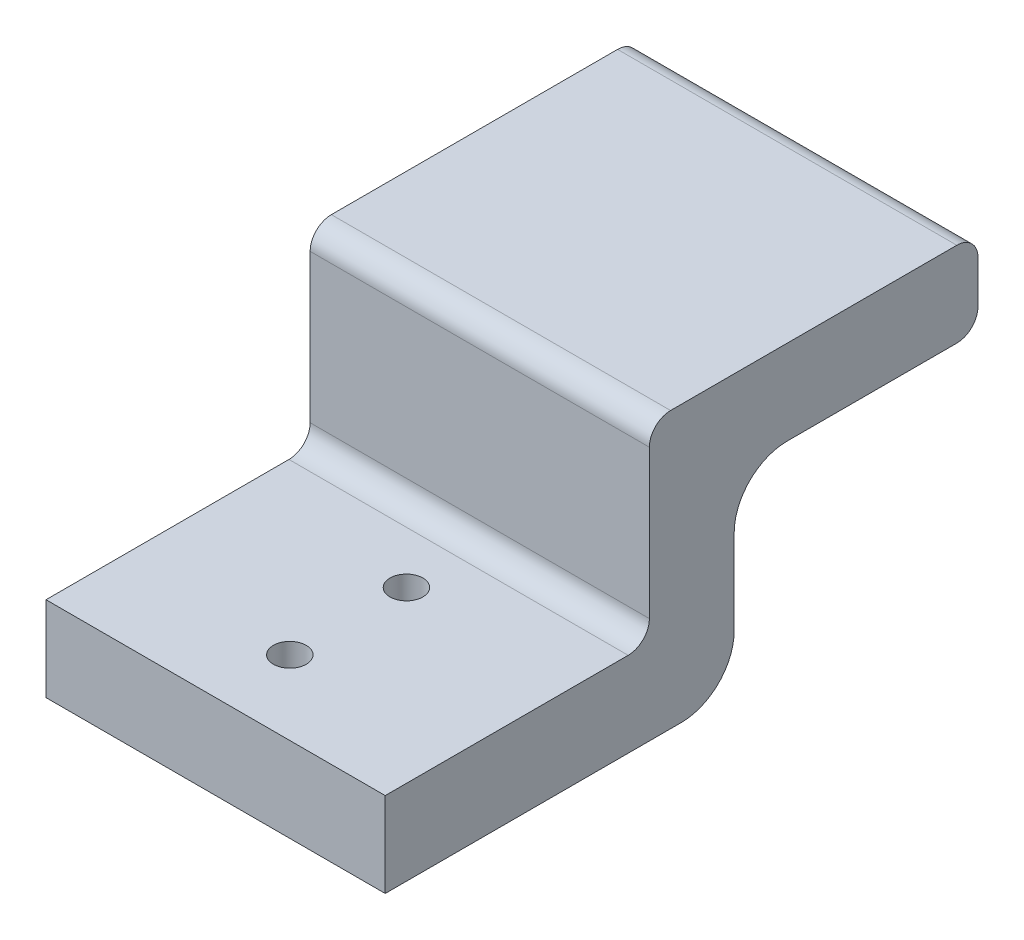
ISO-10303-21;
HEADER;
FILE_DESCRIPTION(('STEP AP214'),'2;1');
FILE_NAME('part.step','',(''),(''),'','','');
FILE_SCHEMA(('AUTOMOTIVE_DESIGN { 1 0 10303 214 1 1 1 1 }'));
ENDSEC;
DATA;
#1=APPLICATION_CONTEXT('core data for automotive mechanical design processes');
#2=APPLICATION_PROTOCOL_DEFINITION('international standard','automotive_design',2000,#1);
#3=PRODUCT_CONTEXT('',#1,'mechanical');
#4=PRODUCT('Part','Part','',(#3));
#5=PRODUCT_RELATED_PRODUCT_CATEGORY('part','',(#4));
#6=PRODUCT_DEFINITION_FORMATION('','',#4);
#7=PRODUCT_DEFINITION_CONTEXT('part definition',#1,'design');
#8=PRODUCT_DEFINITION('design','',#6,#7);
#9=PRODUCT_DEFINITION_SHAPE('','',#8);
#10=(LENGTH_UNIT() NAMED_UNIT(*) SI_UNIT(.MILLI.,.METRE.));
#11=(NAMED_UNIT(*) PLANE_ANGLE_UNIT() SI_UNIT($,.RADIAN.));
#12=(NAMED_UNIT(*) SI_UNIT($,.STERADIAN.) SOLID_ANGLE_UNIT());
#13=UNCERTAINTY_MEASURE_WITH_UNIT(LENGTH_MEASURE(1.E-05),#10,'distance_accuracy_value','');
#14=(GEOMETRIC_REPRESENTATION_CONTEXT(3) GLOBAL_UNCERTAINTY_ASSIGNED_CONTEXT((#13)) GLOBAL_UNIT_ASSIGNED_CONTEXT((#10,
#11,#12)) REPRESENTATION_CONTEXT('',''));
#15=CARTESIAN_POINT('',(0.,0.,0.));
#16=DIRECTION('',(0.,0.,1.));
#17=DIRECTION('',(1.,0.,0.));
#18=AXIS2_PLACEMENT_3D('',#15,#16,#17);
#19=CARTESIAN_POINT('',(-16.,8.,-10.4175714326032));
#20=DIRECTION('',(0.,0.,-1.));
#21=DIRECTION('',(-1.,0.,0.));
#22=AXIS2_PLACEMENT_3D('',#19,#20,#21);
#23=PLANE('',#22);
#24=DIRECTION('',(0.,-1.,0.));
#25=VECTOR('',#24,1.);
#26=CARTESIAN_POINT('',(16.,8.,-10.4175714326032));
#27=LINE('',#26,#25);
#28=CARTESIAN_POINT('',(16.,13.,-10.4175714326032));
#29=VERTEX_POINT('',#28);
#30=CARTESIAN_POINT('',(16.,5.,-10.4175714326032));
#31=VERTEX_POINT('',#30);
#32=EDGE_CURVE('E329',#29,#31,#27,.T.);
#33=ORIENTED_EDGE('',*,*,#32,.T.);
#34=DIRECTION('',(1.,0.,0.));
#35=VECTOR('',#34,1.);
#36=CARTESIAN_POINT('',(-16.,5.,-10.4175714326032));
#37=LINE('',#36,#35);
#38=CARTESIAN_POINT('',(-16.,5.,-10.4175714326032));
#39=VERTEX_POINT('',#38);
#40=EDGE_CURVE('E58',#31,#39,#37,.F.);
#41=ORIENTED_EDGE('',*,*,#40,.T.);
#42=DIRECTION('',(0.,-1.,0.));
#43=VECTOR('',#42,1.);
#44=CARTESIAN_POINT('',(-16.,8.,-10.4175714326032));
#45=LINE('',#44,#43);
#46=CARTESIAN_POINT('',(-16.,13.,-10.4175714326032));
#47=VERTEX_POINT('',#46);
#48=EDGE_CURVE('E336',#47,#39,#45,.T.);
#49=ORIENTED_EDGE('',*,*,#48,.F.);
#50=DIRECTION('',(1.,0.,0.));
#51=VECTOR('',#50,1.);
#52=CARTESIAN_POINT('',(16.,13.,-10.4175714326032));
#53=LINE('',#52,#51);
#54=EDGE_CURVE('E387',#47,#29,#53,.T.);
#55=ORIENTED_EDGE('',*,*,#54,.T.);
#56=EDGE_LOOP('',(#33,#41,#49,#55));
#57=FACE_BOUND('',#56,.T.);
#58=ADVANCED_FACE('F35',(#57),#23,.T.);
#59=CARTESIAN_POINT('',(0.,8.,0.));
#60=DIRECTION('',(0.,-1.,0.));
#61=DIRECTION('',(0.,0.,-1.));
#62=AXIS2_PLACEMENT_3D('',#59,#60,#61);
#63=PLANE('',#62);
#64=CARTESIAN_POINT('',(0.,8.,15.5));
#65=DIRECTION('',(0.,-1.,0.));
#66=DIRECTION('',(0.,0.,-1.));
#67=AXIS2_PLACEMENT_3D('',#64,#65,#66);
#68=CIRCLE('',#67,1.54999999999999);
#69=CARTESIAN_POINT('',(0.,8.,13.95));
#70=VERTEX_POINT('',#69);
#71=EDGE_CURVE('E241',#70,#70,#68,.T.);
#72=ORIENTED_EDGE('',*,*,#71,.T.);
#73=EDGE_LOOP('',(#72));
#74=FACE_BOUND('',#73,.T.);
#75=CARTESIAN_POINT('',(0.,8.,4.50000000000001));
#76=DIRECTION('',(0.,-1.,0.));
#77=DIRECTION('',(0.,0.,-1.));
#78=AXIS2_PLACEMENT_3D('',#75,#76,#77);
#79=CIRCLE('',#78,1.54999999999999);
#80=CARTESIAN_POINT('',(0.,8.,2.95000000000002));
#81=VERTEX_POINT('',#80);
#82=EDGE_CURVE('E450',#81,#81,#79,.T.);
#83=ORIENTED_EDGE('',*,*,#82,.T.);
#84=EDGE_LOOP('',(#83));
#85=FACE_BOUND('',#84,.T.);
#86=DIRECTION('',(0.,0.,1.));
#87=VECTOR('',#86,1.);
#88=CARTESIAN_POINT('',(16.,8.,-10.4175714326032));
#89=LINE('',#88,#87);
#90=CARTESIAN_POINT('',(16.,8.,-0.417571432603155));
#91=VERTEX_POINT('',#90);
#92=CARTESIAN_POINT('',(16.,8.,22.5));
#93=VERTEX_POINT('',#92);
#94=EDGE_CURVE('E320',#91,#93,#89,.T.);
#95=ORIENTED_EDGE('',*,*,#94,.F.);
#96=DIRECTION('',(1.,0.,0.));
#97=VECTOR('',#96,1.);
#98=CARTESIAN_POINT('',(0.,8.,-0.417571432603151));
#99=LINE('',#98,#97);
#100=CARTESIAN_POINT('',(-16.,8.,-0.417571432603146));
#101=VERTEX_POINT('',#100);
#102=EDGE_CURVE('E357',#91,#101,#99,.F.);
#103=ORIENTED_EDGE('',*,*,#102,.T.);
#104=DIRECTION('',(0.,0.,-1.));
#105=VECTOR('',#104,1.);
#106=CARTESIAN_POINT('',(-16.,8.,22.5));
#107=LINE('',#106,#105);
#108=CARTESIAN_POINT('',(-16.,8.,22.5));
#109=VERTEX_POINT('',#108);
#110=EDGE_CURVE('E326',#109,#101,#107,.T.);
#111=ORIENTED_EDGE('',*,*,#110,.F.);
#112=DIRECTION('',(-1.,0.,0.));
#113=VECTOR('',#112,1.);
#114=CARTESIAN_POINT('',(16.,8.,22.5));
#115=LINE('',#114,#113);
#116=EDGE_CURVE('E322',#93,#109,#115,.T.);
#117=ORIENTED_EDGE('',*,*,#116,.F.);
#118=EDGE_LOOP('',(#95,#103,#111,#117));
#119=FACE_BOUND('',#118,.T.);
#120=ADVANCED_FACE('F459',(#74,#85,#119),#63,.F.);
#121=CARTESIAN_POINT('',(-16.,8.,22.5));
#122=DIRECTION('',(-1.,0.,0.));
#123=DIRECTION('',(0.,0.,1.));
#124=AXIS2_PLACEMENT_3D('',#121,#122,#123);
#125=PLANE('',#124);
#126=ORIENTED_EDGE('',*,*,#48,.T.);
#127=CARTESIAN_POINT('',(-16.,5.,-5.41757143260315));
#128=DIRECTION('',(-1.,0.,0.));
#129=DIRECTION('',(0.,0.,1.));
#130=AXIS2_PLACEMENT_3D('',#127,#128,#129);
#131=CIRCLE('',#130,5.);
#132=CARTESIAN_POINT('',(-16.,0.,-5.41757143260315));
#133=VERTEX_POINT('',#132);
#134=EDGE_CURVE('E391',#39,#133,#131,.T.);
#135=ORIENTED_EDGE('',*,*,#134,.T.);
#136=DIRECTION('',(0.,0.,-1.));
#137=VECTOR('',#136,1.);
#138=CARTESIAN_POINT('',(-16.,0.,22.5));
#139=LINE('',#138,#137);
#140=CARTESIAN_POINT('',(-16.,0.,22.5));
#141=VERTEX_POINT('',#140);
#142=EDGE_CURVE('E323',#141,#133,#139,.T.);
#143=ORIENTED_EDGE('',*,*,#142,.F.);
#144=DIRECTION('',(0.,-1.,0.));
#145=VECTOR('',#144,1.);
#146=CARTESIAN_POINT('',(-16.,8.,22.5));
#147=LINE('',#146,#145);
#148=EDGE_CURVE('E339',#109,#141,#147,.T.);
#149=ORIENTED_EDGE('',*,*,#148,.F.);
#150=ORIENTED_EDGE('',*,*,#110,.T.);
#151=CARTESIAN_POINT('',(-16.,10.,-0.417571432603148));
#152=DIRECTION('',(-1.,0.,0.));
#153=DIRECTION('',(0.,0.,1.));
#154=AXIS2_PLACEMENT_3D('',#151,#152,#153);
#155=CIRCLE('',#154,2.);
#156=CARTESIAN_POINT('',(-16.,10.,-2.41757143260315));
#157=VERTEX_POINT('',#156);
#158=EDGE_CURVE('E361',#101,#157,#155,.F.);
#159=ORIENTED_EDGE('',*,*,#158,.T.);
#160=DIRECTION('',(0.,-1.,0.));
#161=VECTOR('',#160,1.);
#162=CARTESIAN_POINT('',(-16.,8.,-2.41757143260315));
#163=LINE('',#162,#161);
#164=CARTESIAN_POINT('',(-16.,24.,-2.41757143260315));
#165=VERTEX_POINT('',#164);
#166=EDGE_CURVE('E436',#165,#157,#163,.T.);
#167=ORIENTED_EDGE('',*,*,#166,.F.);
#168=CARTESIAN_POINT('',(-16.,24.,-4.41757143260315));
#169=DIRECTION('',(-1.,0.,0.));
#170=DIRECTION('',(0.,0.,1.));
#171=AXIS2_PLACEMENT_3D('',#168,#169,#170);
#172=CIRCLE('',#171,2.);
#173=CARTESIAN_POINT('',(-16.,26.,-4.41757143260315));
#174=VERTEX_POINT('',#173);
#175=EDGE_CURVE('E354',#165,#174,#172,.T.);
#176=ORIENTED_EDGE('',*,*,#175,.T.);
#177=DIRECTION('',(0.,0.,1.));
#178=VECTOR('',#177,1.);
#179=CARTESIAN_POINT('',(-16.,26.,-10.4175714326031));
#180=LINE('',#179,#178);
#181=CARTESIAN_POINT('',(-16.,26.,-31.4175714326031));
#182=VERTEX_POINT('',#181);
#183=EDGE_CURVE('E439',#182,#174,#180,.T.);
#184=ORIENTED_EDGE('',*,*,#183,.F.);
#185=CARTESIAN_POINT('',(-16.,24.,-31.4175714326031));
#186=DIRECTION('',(-1.,0.,0.));
#187=DIRECTION('',(0.,0.,1.));
#188=AXIS2_PLACEMENT_3D('',#185,#186,#187);
#189=CIRCLE('',#188,2.);
#190=CARTESIAN_POINT('',(-16.,24.,-33.4175714326031));
#191=VERTEX_POINT('',#190);
#192=EDGE_CURVE('E377',#182,#191,#189,.T.);
#193=ORIENTED_EDGE('',*,*,#192,.T.);
#194=DIRECTION('',(0.,1.,0.));
#195=VECTOR('',#194,1.);
#196=CARTESIAN_POINT('',(-16.,26.,-33.4175714326031));
#197=LINE('',#196,#195);
#198=CARTESIAN_POINT('',(-16.,20.,-33.4175714326031));
#199=VERTEX_POINT('',#198);
#200=EDGE_CURVE('E443',#199,#191,#197,.T.);
#201=ORIENTED_EDGE('',*,*,#200,.F.);
#202=CARTESIAN_POINT('',(-16.,20.,-31.4175714326031));
#203=DIRECTION('',(-1.,0.,0.));
#204=DIRECTION('',(0.,0.,1.));
#205=AXIS2_PLACEMENT_3D('',#202,#203,#204);
#206=CIRCLE('',#205,2.);
#207=CARTESIAN_POINT('',(-16.,18.,-31.4175714326031));
#208=VERTEX_POINT('',#207);
#209=EDGE_CURVE('E374',#199,#208,#206,.T.);
#210=ORIENTED_EDGE('',*,*,#209,.T.);
#211=DIRECTION('',(0.,0.,-1.));
#212=VECTOR('',#211,1.);
#213=CARTESIAN_POINT('',(-16.,18.,-10.4175714326031));
#214=LINE('',#213,#212);
#215=CARTESIAN_POINT('',(-16.,18.,-15.4175714326032));
#216=VERTEX_POINT('',#215);
#217=EDGE_CURVE('E409',#216,#208,#214,.T.);
#218=ORIENTED_EDGE('',*,*,#217,.F.);
#219=CARTESIAN_POINT('',(-16.,13.,-15.4175714326032));
#220=DIRECTION('',(-1.,0.,0.));
#221=DIRECTION('',(0.,0.,1.));
#222=AXIS2_PLACEMENT_3D('',#219,#220,#221);
#223=CIRCLE('',#222,5.);
#224=EDGE_CURVE('E11',#216,#47,#223,.F.);
#225=ORIENTED_EDGE('',*,*,#224,.T.);
#226=EDGE_LOOP('',(#126,#135,#143,#149,#150,#159,#167,#176,#184,#193,#201,#210,#218,#225));
#227=FACE_BOUND('',#226,.T.);
#228=ADVANCED_FACE('F407',(#227),#125,.T.);
#229=CARTESIAN_POINT('',(16.,8.,22.5));
#230=DIRECTION('',(0.,0.,1.));
#231=DIRECTION('',(1.,0.,0.));
#232=AXIS2_PLACEMENT_3D('',#229,#230,#231);
#233=PLANE('',#232);
#234=DIRECTION('',(-1.,0.,0.));
#235=VECTOR('',#234,1.);
#236=CARTESIAN_POINT('',(16.,0.,22.5));
#237=LINE('',#236,#235);
#238=CARTESIAN_POINT('',(16.,0.,22.5));
#239=VERTEX_POINT('',#238);
#240=EDGE_CURVE('E331',#239,#141,#237,.T.);
#241=ORIENTED_EDGE('',*,*,#240,.F.);
#242=DIRECTION('',(0.,-1.,0.));
#243=VECTOR('',#242,1.);
#244=CARTESIAN_POINT('',(16.,8.,22.5));
#245=LINE('',#244,#243);
#246=EDGE_CURVE('E341',#93,#239,#245,.T.);
#247=ORIENTED_EDGE('',*,*,#246,.F.);
#248=ORIENTED_EDGE('',*,*,#116,.T.);
#249=ORIENTED_EDGE('',*,*,#148,.T.);
#250=EDGE_LOOP('',(#241,#247,#248,#249));
#251=FACE_BOUND('',#250,.T.);
#252=ADVANCED_FACE('F419',(#251),#233,.T.);
#253=CARTESIAN_POINT('',(16.,8.,-10.4175714326032));
#254=DIRECTION('',(1.,0.,0.));
#255=DIRECTION('',(0.,0.,-1.));
#256=AXIS2_PLACEMENT_3D('',#253,#254,#255);
#257=PLANE('',#256);
#258=DIRECTION('',(0.,0.,1.));
#259=VECTOR('',#258,1.);
#260=CARTESIAN_POINT('',(16.,0.,-10.4175714326032));
#261=LINE('',#260,#259);
#262=CARTESIAN_POINT('',(16.,0.,-5.41757143260315));
#263=VERTEX_POINT('',#262);
#264=EDGE_CURVE('E309',#263,#239,#261,.T.);
#265=ORIENTED_EDGE('',*,*,#264,.F.);
#266=CARTESIAN_POINT('',(16.,5.,-5.41757143260315));
#267=DIRECTION('',(1.,0.,0.));
#268=DIRECTION('',(0.,0.,-1.));
#269=AXIS2_PLACEMENT_3D('',#266,#267,#268);
#270=CIRCLE('',#269,5.);
#271=EDGE_CURVE('E385',#263,#31,#270,.T.);
#272=ORIENTED_EDGE('',*,*,#271,.T.);
#273=ORIENTED_EDGE('',*,*,#32,.F.);
#274=CARTESIAN_POINT('',(16.,13.,-15.4175714326032));
#275=DIRECTION('',(1.,0.,0.));
#276=DIRECTION('',(0.,0.,-1.));
#277=AXIS2_PLACEMENT_3D('',#274,#275,#276);
#278=CIRCLE('',#277,5.);
#279=CARTESIAN_POINT('',(16.,18.,-15.4175714326032));
#280=VERTEX_POINT('',#279);
#281=EDGE_CURVE('E43',#29,#280,#278,.F.);
#282=ORIENTED_EDGE('',*,*,#281,.T.);
#283=DIRECTION('',(0.,0.,-1.));
#284=VECTOR('',#283,1.);
#285=CARTESIAN_POINT('',(16.,18.,-10.4175714326032));
#286=LINE('',#285,#284);
#287=CARTESIAN_POINT('',(16.,18.,-31.4175714326031));
#288=VERTEX_POINT('',#287);
#289=EDGE_CURVE('E397',#280,#288,#286,.T.);
#290=ORIENTED_EDGE('',*,*,#289,.T.);
#291=CARTESIAN_POINT('',(16.,20.,-31.4175714326031));
#292=DIRECTION('',(1.,0.,0.));
#293=DIRECTION('',(0.,0.,-1.));
#294=AXIS2_PLACEMENT_3D('',#291,#292,#293);
#295=CIRCLE('',#294,2.);
#296=CARTESIAN_POINT('',(16.,20.,-33.4175714326031));
#297=VERTEX_POINT('',#296);
#298=EDGE_CURVE('E368',#288,#297,#295,.T.);
#299=ORIENTED_EDGE('',*,*,#298,.T.);
#300=DIRECTION('',(0.,1.,0.));
#301=VECTOR('',#300,1.);
#302=CARTESIAN_POINT('',(16.,26.,-33.4175714326031));
#303=LINE('',#302,#301);
#304=CARTESIAN_POINT('',(16.,24.,-33.4175714326031));
#305=VERTEX_POINT('',#304);
#306=EDGE_CURVE('E403',#297,#305,#303,.T.);
#307=ORIENTED_EDGE('',*,*,#306,.T.);
#308=CARTESIAN_POINT('',(16.,24.,-31.4175714326031));
#309=DIRECTION('',(1.,0.,0.));
#310=DIRECTION('',(0.,0.,-1.));
#311=AXIS2_PLACEMENT_3D('',#308,#309,#310);
#312=CIRCLE('',#311,2.);
#313=CARTESIAN_POINT('',(16.,26.,-31.4175714326031));
#314=VERTEX_POINT('',#313);
#315=EDGE_CURVE('E370',#305,#314,#312,.T.);
#316=ORIENTED_EDGE('',*,*,#315,.T.);
#317=DIRECTION('',(0.,0.,1.));
#318=VECTOR('',#317,1.);
#319=CARTESIAN_POINT('',(16.,26.,-10.4175714326032));
#320=LINE('',#319,#318);
#321=CARTESIAN_POINT('',(16.,26.,-4.41757143260315));
#322=VERTEX_POINT('',#321);
#323=EDGE_CURVE('E440',#314,#322,#320,.T.);
#324=ORIENTED_EDGE('',*,*,#323,.T.);
#325=CARTESIAN_POINT('',(16.,24.,-4.41757143260315));
#326=DIRECTION('',(1.,0.,0.));
#327=DIRECTION('',(0.,0.,-1.));
#328=AXIS2_PLACEMENT_3D('',#325,#326,#327);
#329=CIRCLE('',#328,2.);
#330=CARTESIAN_POINT('',(16.,24.,-2.41757143260315));
#331=VERTEX_POINT('',#330);
#332=EDGE_CURVE('E347',#322,#331,#329,.T.);
#333=ORIENTED_EDGE('',*,*,#332,.T.);
#334=DIRECTION('',(0.,-1.,0.));
#335=VECTOR('',#334,1.);
#336=CARTESIAN_POINT('',(16.,8.,-2.41757143260315));
#337=LINE('',#336,#335);
#338=CARTESIAN_POINT('',(16.,10.,-2.41757143260315));
#339=VERTEX_POINT('',#338);
#340=EDGE_CURVE('E434',#331,#339,#337,.T.);
#341=ORIENTED_EDGE('',*,*,#340,.T.);
#342=CARTESIAN_POINT('',(16.,10.,-0.417571432603154));
#343=DIRECTION('',(1.,0.,0.));
#344=DIRECTION('',(0.,0.,-1.));
#345=AXIS2_PLACEMENT_3D('',#342,#343,#344);
#346=CIRCLE('',#345,2.);
#347=EDGE_CURVE('E359',#339,#91,#346,.F.);
#348=ORIENTED_EDGE('',*,*,#347,.T.);
#349=ORIENTED_EDGE('',*,*,#94,.T.);
#350=ORIENTED_EDGE('',*,*,#246,.T.);
#351=EDGE_LOOP('',(#265,#272,#273,#282,#290,#299,#307,#316,#324,#333,#341,#348,#349,#350));
#352=FACE_BOUND('',#351,.T.);
#353=ADVANCED_FACE('F396',(#352),#257,.T.);
#354=CARTESIAN_POINT('',(0.,0.,0.));
#355=DIRECTION('',(0.,-1.,0.));
#356=DIRECTION('',(0.,0.,-1.));
#357=AXIS2_PLACEMENT_3D('',#354,#355,#356);
#358=PLANE('',#357);
#359=DIRECTION('',(-0.5,0.,0.866025403784439));
#360=VECTOR('',#359,1.);
#361=CARTESIAN_POINT('',(3.34863156129984,0.,4.50000000000001));
#362=LINE('',#361,#360);
#363=CARTESIAN_POINT('',(3.34863156129984,0.,4.50000000000001));
#364=VERTEX_POINT('',#363);
#365=CARTESIAN_POINT('',(1.67431578064992,0.,7.40000000000001));
#366=VERTEX_POINT('',#365);
#367=EDGE_CURVE('E217',#364,#366,#362,.T.);
#368=ORIENTED_EDGE('',*,*,#367,.F.);
#369=DIRECTION('',(0.5,0.,0.866025403784439));
#370=VECTOR('',#369,1.);
#371=CARTESIAN_POINT('',(1.67431578064992,0.,1.6));
#372=LINE('',#371,#370);
#373=CARTESIAN_POINT('',(1.67431578064992,0.,1.6));
#374=VERTEX_POINT('',#373);
#375=EDGE_CURVE('E235',#374,#364,#372,.T.);
#376=ORIENTED_EDGE('',*,*,#375,.F.);
#377=DIRECTION('',(1.,0.,0.));
#378=VECTOR('',#377,1.);
#379=CARTESIAN_POINT('',(-1.67431578064991,0.,1.6));
#380=LINE('',#379,#378);
#381=CARTESIAN_POINT('',(-1.67431578064991,0.,1.6));
#382=VERTEX_POINT('',#381);
#383=EDGE_CURVE('E238',#382,#374,#380,.T.);
#384=ORIENTED_EDGE('',*,*,#383,.F.);
#385=DIRECTION('',(0.5,0.,-0.866025403784439));
#386=VECTOR('',#385,1.);
#387=CARTESIAN_POINT('',(-3.34863156129983,0.,4.50000000000001));
#388=LINE('',#387,#386);
#389=CARTESIAN_POINT('',(-3.34863156129983,0.,4.50000000000001));
#390=VERTEX_POINT('',#389);
#391=EDGE_CURVE('E257',#390,#382,#388,.T.);
#392=ORIENTED_EDGE('',*,*,#391,.F.);
#393=DIRECTION('',(-0.5,0.,-0.866025403784438));
#394=VECTOR('',#393,1.);
#395=CARTESIAN_POINT('',(-1.67431578064991,0.,7.40000000000001));
#396=LINE('',#395,#394);
#397=CARTESIAN_POINT('',(-1.67431578064991,0.,7.40000000000001));
#398=VERTEX_POINT('',#397);
#399=EDGE_CURVE('E254',#398,#390,#396,.T.);
#400=ORIENTED_EDGE('',*,*,#399,.F.);
#401=DIRECTION('',(-1.,0.,0.));
#402=VECTOR('',#401,1.);
#403=CARTESIAN_POINT('',(1.67431578064992,0.,7.40000000000001));
#404=LINE('',#403,#402);
#405=EDGE_CURVE('E252',#366,#398,#404,.T.);
#406=ORIENTED_EDGE('',*,*,#405,.F.);
#407=EDGE_LOOP('',(#368,#376,#384,#392,#400,#406));
#408=FACE_BOUND('',#407,.T.);
#409=DIRECTION('',(-1.,0.,0.));
#410=VECTOR('',#409,1.);
#411=CARTESIAN_POINT('',(1.67431578064992,0.,18.4));
#412=LINE('',#411,#410);
#413=CARTESIAN_POINT('',(1.67431578064992,0.,18.4));
#414=VERTEX_POINT('',#413);
#415=CARTESIAN_POINT('',(-1.67431578064991,0.,18.4));
#416=VERTEX_POINT('',#415);
#417=EDGE_CURVE('E264',#414,#416,#412,.T.);
#418=ORIENTED_EDGE('',*,*,#417,.F.);
#419=DIRECTION('',(-0.5,0.,0.866025403784438));
#420=VECTOR('',#419,1.);
#421=CARTESIAN_POINT('',(3.34863156129984,0.,15.5));
#422=LINE('',#421,#420);
#423=CARTESIAN_POINT('',(3.34863156129984,0.,15.5));
#424=VERTEX_POINT('',#423);
#425=EDGE_CURVE('E276',#424,#414,#422,.T.);
#426=ORIENTED_EDGE('',*,*,#425,.F.);
#427=DIRECTION('',(0.5,0.,0.866025403784439));
#428=VECTOR('',#427,1.);
#429=CARTESIAN_POINT('',(1.67431578064992,0.,12.6));
#430=LINE('',#429,#428);
#431=CARTESIAN_POINT('',(1.67431578064992,0.,12.6));
#432=VERTEX_POINT('',#431);
#433=EDGE_CURVE('E302',#432,#424,#430,.T.);
#434=ORIENTED_EDGE('',*,*,#433,.F.);
#435=DIRECTION('',(1.,0.,0.));
#436=VECTOR('',#435,1.);
#437=CARTESIAN_POINT('',(-1.67431578064991,0.,12.6));
#438=LINE('',#437,#436);
#439=CARTESIAN_POINT('',(-1.67431578064991,0.,12.6));
#440=VERTEX_POINT('',#439);
#441=EDGE_CURVE('E299',#440,#432,#438,.T.);
#442=ORIENTED_EDGE('',*,*,#441,.F.);
#443=DIRECTION('',(0.5,0.,-0.866025403784438));
#444=VECTOR('',#443,1.);
#445=CARTESIAN_POINT('',(-3.34863156129983,0.,15.5));
#446=LINE('',#445,#444);
#447=CARTESIAN_POINT('',(-3.34863156129983,0.,15.5));
#448=VERTEX_POINT('',#447);
#449=EDGE_CURVE('E296',#448,#440,#446,.T.);
#450=ORIENTED_EDGE('',*,*,#449,.F.);
#451=DIRECTION('',(-0.5,0.,-0.866025403784438));
#452=VECTOR('',#451,1.);
#453=CARTESIAN_POINT('',(-1.67431578064991,0.,18.4));
#454=LINE('',#453,#452);
#455=EDGE_CURVE('E293',#416,#448,#454,.T.);
#456=ORIENTED_EDGE('',*,*,#455,.F.);
#457=EDGE_LOOP('',(#418,#426,#434,#442,#450,#456));
#458=FACE_BOUND('',#457,.T.);
#459=ORIENTED_EDGE('',*,*,#142,.T.);
#460=DIRECTION('',(1.,0.,0.));
#461=VECTOR('',#460,1.);
#462=CARTESIAN_POINT('',(0.,0.,-5.41757143260315));
#463=LINE('',#462,#461);
#464=EDGE_CURVE('E382',#133,#263,#463,.T.);
#465=ORIENTED_EDGE('',*,*,#464,.T.);
#466=ORIENTED_EDGE('',*,*,#264,.T.);
#467=ORIENTED_EDGE('',*,*,#240,.T.);
#468=EDGE_LOOP('',(#459,#465,#466,#467));
#469=FACE_BOUND('',#468,.T.);
#470=ADVANCED_FACE('F415',(#408,#458,#469),#358,.T.);
#471=CARTESIAN_POINT('',(1.67431578064992,2.8,18.4));
#472=DIRECTION('',(0.,0.,1.));
#473=DIRECTION('',(1.,0.,0.));
#474=AXIS2_PLACEMENT_3D('',#471,#472,#473);
#475=PLANE('',#474);
#476=ORIENTED_EDGE('',*,*,#417,.T.);
#477=DIRECTION('',(0.,-1.,0.));
#478=VECTOR('',#477,1.);
#479=CARTESIAN_POINT('',(-1.67431578064991,2.8,18.4));
#480=LINE('',#479,#478);
#481=CARTESIAN_POINT('',(-1.67431578064991,2.8,18.4));
#482=VERTEX_POINT('',#481);
#483=EDGE_CURVE('E291',#482,#416,#480,.T.);
#484=ORIENTED_EDGE('',*,*,#483,.F.);
#485=DIRECTION('',(-1.,0.,0.));
#486=VECTOR('',#485,1.);
#487=CARTESIAN_POINT('',(1.67431578064992,2.8,18.4));
#488=LINE('',#487,#486);
#489=CARTESIAN_POINT('',(1.67431578064992,2.8,18.4));
#490=VERTEX_POINT('',#489);
#491=EDGE_CURVE('E272',#490,#482,#488,.T.);
#492=ORIENTED_EDGE('',*,*,#491,.F.);
#493=DIRECTION('',(0.,-1.,0.));
#494=VECTOR('',#493,1.);
#495=CARTESIAN_POINT('',(1.67431578064992,2.8,18.4));
#496=LINE('',#495,#494);
#497=EDGE_CURVE('E307',#490,#414,#496,.T.);
#498=ORIENTED_EDGE('',*,*,#497,.T.);
#499=EDGE_LOOP('',(#476,#484,#492,#498));
#500=FACE_BOUND('',#499,.T.);
#501=ADVANCED_FACE('F528',(#500),#475,.F.);
#502=CARTESIAN_POINT('',(3.34863156129984,2.8,15.5));
#503=DIRECTION('',(0.866025403784438,0.,0.5));
#504=DIRECTION('',(0.5,0.,-0.866025403784438));
#505=AXIS2_PLACEMENT_3D('',#502,#503,#504);
#506=PLANE('',#505);
#507=ORIENTED_EDGE('',*,*,#425,.T.);
#508=ORIENTED_EDGE('',*,*,#497,.F.);
#509=DIRECTION('',(-0.5,0.,0.866025403784438));
#510=VECTOR('',#509,1.);
#511=CARTESIAN_POINT('',(3.34863156129984,2.8,15.5));
#512=LINE('',#511,#510);
#513=CARTESIAN_POINT('',(3.34863156129984,2.8,15.5));
#514=VERTEX_POINT('',#513);
#515=EDGE_CURVE('E288',#514,#490,#512,.T.);
#516=ORIENTED_EDGE('',*,*,#515,.F.);
#517=DIRECTION('',(0.,-1.,0.));
#518=VECTOR('',#517,1.);
#519=CARTESIAN_POINT('',(3.34863156129984,2.8,15.5));
#520=LINE('',#519,#518);
#521=EDGE_CURVE('E310',#514,#424,#520,.T.);
#522=ORIENTED_EDGE('',*,*,#521,.T.);
#523=EDGE_LOOP('',(#507,#508,#516,#522));
#524=FACE_BOUND('',#523,.T.);
#525=ADVANCED_FACE('F731',(#524),#506,.F.);
#526=CARTESIAN_POINT('',(1.67431578064992,2.8,12.6));
#527=DIRECTION('',(0.866025403784439,0.,-0.5));
#528=DIRECTION('',(-0.5,0.,-0.866025403784439));
#529=AXIS2_PLACEMENT_3D('',#526,#527,#528);
#530=PLANE('',#529);
#531=ORIENTED_EDGE('',*,*,#433,.T.);
#532=ORIENTED_EDGE('',*,*,#521,.F.);
#533=DIRECTION('',(0.5,0.,0.866025403784439));
#534=VECTOR('',#533,1.);
#535=CARTESIAN_POINT('',(1.67431578064992,2.8,12.6));
#536=LINE('',#535,#534);
#537=CARTESIAN_POINT('',(1.67431578064992,2.8,12.6));
#538=VERTEX_POINT('',#537);
#539=EDGE_CURVE('E285',#538,#514,#536,.T.);
#540=ORIENTED_EDGE('',*,*,#539,.F.);
#541=DIRECTION('',(0.,-1.,0.));
#542=VECTOR('',#541,1.);
#543=CARTESIAN_POINT('',(1.67431578064992,2.8,12.6));
#544=LINE('',#543,#542);
#545=EDGE_CURVE('E312',#538,#432,#544,.T.);
#546=ORIENTED_EDGE('',*,*,#545,.T.);
#547=EDGE_LOOP('',(#531,#532,#540,#546));
#548=FACE_BOUND('',#547,.T.);
#549=ADVANCED_FACE('F721',(#548),#530,.F.);
#550=CARTESIAN_POINT('',(-1.67431578064991,2.8,12.6));
#551=DIRECTION('',(0.,0.,-1.));
#552=DIRECTION('',(-1.,0.,0.));
#553=AXIS2_PLACEMENT_3D('',#550,#551,#552);
#554=PLANE('',#553);
#555=ORIENTED_EDGE('',*,*,#441,.T.);
#556=ORIENTED_EDGE('',*,*,#545,.F.);
#557=DIRECTION('',(1.,0.,0.));
#558=VECTOR('',#557,1.);
#559=CARTESIAN_POINT('',(-1.67431578064991,2.8,12.6));
#560=LINE('',#559,#558);
#561=CARTESIAN_POINT('',(-1.67431578064991,2.8,12.6));
#562=VERTEX_POINT('',#561);
#563=EDGE_CURVE('E282',#562,#538,#560,.T.);
#564=ORIENTED_EDGE('',*,*,#563,.F.);
#565=DIRECTION('',(0.,-1.,0.));
#566=VECTOR('',#565,1.);
#567=CARTESIAN_POINT('',(-1.67431578064991,2.8,12.6));
#568=LINE('',#567,#566);
#569=EDGE_CURVE('E314',#562,#440,#568,.T.);
#570=ORIENTED_EDGE('',*,*,#569,.T.);
#571=EDGE_LOOP('',(#555,#556,#564,#570));
#572=FACE_BOUND('',#571,.T.);
#573=ADVANCED_FACE('F711',(#572),#554,.F.);
#574=CARTESIAN_POINT('',(-3.34863156129983,2.8,15.5));
#575=DIRECTION('',(-0.866025403784438,0.,-0.5));
#576=DIRECTION('',(-0.5,0.,0.866025403784438));
#577=AXIS2_PLACEMENT_3D('',#574,#575,#576);
#578=PLANE('',#577);
#579=ORIENTED_EDGE('',*,*,#449,.T.);
#580=ORIENTED_EDGE('',*,*,#569,.F.);
#581=DIRECTION('',(0.5,0.,-0.866025403784438));
#582=VECTOR('',#581,1.);
#583=CARTESIAN_POINT('',(-3.34863156129983,2.8,15.5));
#584=LINE('',#583,#582);
#585=CARTESIAN_POINT('',(-3.34863156129983,2.8,15.5));
#586=VERTEX_POINT('',#585);
#587=EDGE_CURVE('E279',#586,#562,#584,.T.);
#588=ORIENTED_EDGE('',*,*,#587,.F.);
#589=DIRECTION('',(0.,-1.,0.));
#590=VECTOR('',#589,1.);
#591=CARTESIAN_POINT('',(-3.34863156129983,2.8,15.5));
#592=LINE('',#591,#590);
#593=EDGE_CURVE('E316',#586,#448,#592,.T.);
#594=ORIENTED_EDGE('',*,*,#593,.T.);
#595=EDGE_LOOP('',(#579,#580,#588,#594));
#596=FACE_BOUND('',#595,.T.);
#597=ADVANCED_FACE('F701',(#596),#578,.F.);
#598=CARTESIAN_POINT('',(-1.67431578064991,2.8,18.4));
#599=DIRECTION('',(-0.866025403784439,0.,0.5));
#600=DIRECTION('',(0.5,0.,0.866025403784439));
#601=AXIS2_PLACEMENT_3D('',#598,#599,#600);
#602=PLANE('',#601);
#603=ORIENTED_EDGE('',*,*,#455,.T.);
#604=ORIENTED_EDGE('',*,*,#593,.F.);
#605=DIRECTION('',(-0.5,0.,-0.866025403784438));
#606=VECTOR('',#605,1.);
#607=CARTESIAN_POINT('',(-1.67431578064991,2.8,18.4));
#608=LINE('',#607,#606);
#609=EDGE_CURVE('E275',#482,#586,#608,.T.);
#610=ORIENTED_EDGE('',*,*,#609,.F.);
#611=ORIENTED_EDGE('',*,*,#483,.T.);
#612=EDGE_LOOP('',(#603,#604,#610,#611));
#613=FACE_BOUND('',#612,.T.);
#614=ADVANCED_FACE('F637',(#613),#602,.F.);
#615=CARTESIAN_POINT('',(0.,2.8,0.));
#616=DIRECTION('',(0.,-1.,0.));
#617=DIRECTION('',(0.,0.,-1.));
#618=AXIS2_PLACEMENT_3D('',#615,#616,#617);
#619=PLANE('',#618);
#620=CARTESIAN_POINT('',(0.,2.8,15.5));
#621=DIRECTION('',(0.,-1.,0.));
#622=DIRECTION('',(0.,0.,-1.));
#623=AXIS2_PLACEMENT_3D('',#620,#621,#622);
#624=CIRCLE('',#623,1.54999999999999);
#625=CARTESIAN_POINT('',(0.,2.8,13.95));
#626=VERTEX_POINT('',#625);
#627=EDGE_CURVE('E452',#626,#626,#624,.T.);
#628=ORIENTED_EDGE('',*,*,#627,.F.);
#629=EDGE_LOOP('',(#628));
#630=FACE_BOUND('',#629,.T.);
#631=ORIENTED_EDGE('',*,*,#491,.T.);
#632=ORIENTED_EDGE('',*,*,#609,.T.);
#633=ORIENTED_EDGE('',*,*,#587,.T.);
#634=ORIENTED_EDGE('',*,*,#563,.T.);
#635=ORIENTED_EDGE('',*,*,#539,.T.);
#636=ORIENTED_EDGE('',*,*,#515,.T.);
#637=EDGE_LOOP('',(#631,#632,#633,#634,#635,#636));
#638=FACE_BOUND('',#637,.T.);
#639=ADVANCED_FACE('F632',(#630,#638),#619,.T.);
#640=CARTESIAN_POINT('',(3.34863156129984,2.8,4.50000000000001));
#641=DIRECTION('',(0.866025403784439,0.,0.5));
#642=DIRECTION('',(0.5,0.,-0.866025403784439));
#643=AXIS2_PLACEMENT_3D('',#640,#641,#642);
#644=PLANE('',#643);
#645=ORIENTED_EDGE('',*,*,#367,.T.);
#646=DIRECTION('',(0.,-1.,0.));
#647=VECTOR('',#646,1.);
#648=CARTESIAN_POINT('',(1.67431578064992,2.8,7.40000000000001));
#649=LINE('',#648,#647);
#650=CARTESIAN_POINT('',(1.67431578064992,2.8,7.40000000000001));
#651=VERTEX_POINT('',#650);
#652=EDGE_CURVE('E210',#651,#366,#649,.T.);
#653=ORIENTED_EDGE('',*,*,#652,.F.);
#654=DIRECTION('',(-0.5,0.,0.866025403784439));
#655=VECTOR('',#654,1.);
#656=CARTESIAN_POINT('',(3.34863156129984,2.8,4.50000000000001));
#657=LINE('',#656,#655);
#658=CARTESIAN_POINT('',(3.34863156129984,2.8,4.50000000000001));
#659=VERTEX_POINT('',#658);
#660=EDGE_CURVE('E214',#659,#651,#657,.T.);
#661=ORIENTED_EDGE('',*,*,#660,.F.);
#662=DIRECTION('',(0.,-1.,0.));
#663=VECTOR('',#662,1.);
#664=CARTESIAN_POINT('',(3.34863156129984,2.8,4.50000000000001));
#665=LINE('',#664,#663);
#666=EDGE_CURVE('E262',#659,#364,#665,.T.);
#667=ORIENTED_EDGE('',*,*,#666,.T.);
#668=EDGE_LOOP('',(#645,#653,#661,#667));
#669=FACE_BOUND('',#668,.T.);
#670=ADVANCED_FACE('F212',(#669),#644,.F.);
#671=CARTESIAN_POINT('',(1.67431578064992,2.8,1.6));
#672=DIRECTION('',(0.866025403784439,0.,-0.5));
#673=DIRECTION('',(-0.5,0.,-0.866025403784439));
#674=AXIS2_PLACEMENT_3D('',#671,#672,#673);
#675=PLANE('',#674);
#676=ORIENTED_EDGE('',*,*,#375,.T.);
#677=ORIENTED_EDGE('',*,*,#666,.F.);
#678=DIRECTION('',(0.5,0.,0.866025403784439));
#679=VECTOR('',#678,1.);
#680=CARTESIAN_POINT('',(1.67431578064992,2.8,1.6));
#681=LINE('',#680,#679);
#682=CARTESIAN_POINT('',(1.67431578064992,2.8,1.6));
#683=VERTEX_POINT('',#682);
#684=EDGE_CURVE('E222',#683,#659,#681,.T.);
#685=ORIENTED_EDGE('',*,*,#684,.F.);
#686=DIRECTION('',(0.,-1.,0.));
#687=VECTOR('',#686,1.);
#688=CARTESIAN_POINT('',(1.67431578064992,2.8,1.6));
#689=LINE('',#688,#687);
#690=EDGE_CURVE('E265',#683,#374,#689,.T.);
#691=ORIENTED_EDGE('',*,*,#690,.T.);
#692=EDGE_LOOP('',(#676,#677,#685,#691));
#693=FACE_BOUND('',#692,.T.);
#694=ADVANCED_FACE('F678',(#693),#675,.F.);
#695=CARTESIAN_POINT('',(-1.67431578064991,2.8,1.6));
#696=DIRECTION('',(0.,0.,-1.));
#697=DIRECTION('',(-1.,0.,0.));
#698=AXIS2_PLACEMENT_3D('',#695,#696,#697);
#699=PLANE('',#698);
#700=ORIENTED_EDGE('',*,*,#383,.T.);
#701=ORIENTED_EDGE('',*,*,#690,.F.);
#702=DIRECTION('',(1.,0.,0.));
#703=VECTOR('',#702,1.);
#704=CARTESIAN_POINT('',(-1.67431578064991,2.8,1.6));
#705=LINE('',#704,#703);
#706=CARTESIAN_POINT('',(-1.67431578064991,2.8,1.6));
#707=VERTEX_POINT('',#706);
#708=EDGE_CURVE('E248',#707,#683,#705,.T.);
#709=ORIENTED_EDGE('',*,*,#708,.F.);
#710=DIRECTION('',(0.,-1.,0.));
#711=VECTOR('',#710,1.);
#712=CARTESIAN_POINT('',(-1.67431578064991,2.8,1.6));
#713=LINE('',#712,#711);
#714=EDGE_CURVE('E267',#707,#382,#713,.T.);
#715=ORIENTED_EDGE('',*,*,#714,.T.);
#716=EDGE_LOOP('',(#700,#701,#709,#715));
#717=FACE_BOUND('',#716,.T.);
#718=ADVANCED_FACE('F668',(#717),#699,.F.);
#719=CARTESIAN_POINT('',(-3.34863156129983,2.8,4.50000000000001));
#720=DIRECTION('',(-0.866025403784439,0.,-0.5));
#721=DIRECTION('',(-0.5,0.,0.866025403784439));
#722=AXIS2_PLACEMENT_3D('',#719,#720,#721);
#723=PLANE('',#722);
#724=ORIENTED_EDGE('',*,*,#391,.T.);
#725=ORIENTED_EDGE('',*,*,#714,.F.);
#726=DIRECTION('',(0.5,0.,-0.866025403784439));
#727=VECTOR('',#726,1.);
#728=CARTESIAN_POINT('',(-3.34863156129983,2.8,4.50000000000001));
#729=LINE('',#728,#727);
#730=CARTESIAN_POINT('',(-3.34863156129983,2.8,4.50000000000001));
#731=VERTEX_POINT('',#730);
#732=EDGE_CURVE('E245',#731,#707,#729,.T.);
#733=ORIENTED_EDGE('',*,*,#732,.F.);
#734=DIRECTION('',(0.,-1.,0.));
#735=VECTOR('',#734,1.);
#736=CARTESIAN_POINT('',(-3.34863156129983,2.8,4.50000000000001));
#737=LINE('',#736,#735);
#738=EDGE_CURVE('E269',#731,#390,#737,.T.);
#739=ORIENTED_EDGE('',*,*,#738,.T.);
#740=EDGE_LOOP('',(#724,#725,#733,#739));
#741=FACE_BOUND('',#740,.T.);
#742=ADVANCED_FACE('F658',(#741),#723,.F.);
#743=CARTESIAN_POINT('',(-1.67431578064991,2.8,7.40000000000001));
#744=DIRECTION('',(-0.866025403784438,0.,0.5));
#745=DIRECTION('',(0.5,0.,0.866025403784439));
#746=AXIS2_PLACEMENT_3D('',#743,#744,#745);
#747=PLANE('',#746);
#748=ORIENTED_EDGE('',*,*,#399,.T.);
#749=ORIENTED_EDGE('',*,*,#738,.F.);
#750=DIRECTION('',(-0.5,0.,-0.866025403784438));
#751=VECTOR('',#750,1.);
#752=CARTESIAN_POINT('',(-1.67431578064991,2.8,7.40000000000001));
#753=LINE('',#752,#751);
#754=CARTESIAN_POINT('',(-1.67431578064991,2.8,7.40000000000001));
#755=VERTEX_POINT('',#754);
#756=EDGE_CURVE('E230',#755,#731,#753,.T.);
#757=ORIENTED_EDGE('',*,*,#756,.F.);
#758=DIRECTION('',(0.,-1.,0.));
#759=VECTOR('',#758,1.);
#760=CARTESIAN_POINT('',(-1.67431578064991,2.8,7.40000000000001));
#761=LINE('',#760,#759);
#762=EDGE_CURVE('E221',#755,#398,#761,.T.);
#763=ORIENTED_EDGE('',*,*,#762,.T.);
#764=EDGE_LOOP('',(#748,#749,#757,#763));
#765=FACE_BOUND('',#764,.T.);
#766=ADVANCED_FACE('F649',(#765),#747,.F.);
#767=CARTESIAN_POINT('',(1.67431578064992,2.8,7.40000000000001));
#768=DIRECTION('',(0.,0.,1.));
#769=DIRECTION('',(1.,0.,0.));
#770=AXIS2_PLACEMENT_3D('',#767,#768,#769);
#771=PLANE('',#770);
#772=ORIENTED_EDGE('',*,*,#405,.T.);
#773=ORIENTED_EDGE('',*,*,#762,.F.);
#774=DIRECTION('',(-1.,0.,0.));
#775=VECTOR('',#774,1.);
#776=CARTESIAN_POINT('',(1.67431578064992,2.8,7.40000000000001));
#777=LINE('',#776,#775);
#778=EDGE_CURVE('E225',#651,#755,#777,.T.);
#779=ORIENTED_EDGE('',*,*,#778,.F.);
#780=ORIENTED_EDGE('',*,*,#652,.T.);
#781=EDGE_LOOP('',(#772,#773,#779,#780));
#782=FACE_BOUND('',#781,.T.);
#783=ADVANCED_FACE('F226',(#782),#771,.F.);
#784=CARTESIAN_POINT('',(0.,2.8,0.));
#785=DIRECTION('',(0.,-1.,0.));
#786=DIRECTION('',(0.,0.,-1.));
#787=AXIS2_PLACEMENT_3D('',#784,#785,#786);
#788=PLANE('',#787);
#789=CARTESIAN_POINT('',(0.,2.8,4.50000000000001));
#790=DIRECTION('',(0.,-1.,0.));
#791=DIRECTION('',(0.,0.,-1.));
#792=AXIS2_PLACEMENT_3D('',#789,#790,#791);
#793=CIRCLE('',#792,1.54999999999999);
#794=CARTESIAN_POINT('',(0.,2.8,2.95000000000002));
#795=VERTEX_POINT('',#794);
#796=EDGE_CURVE('E447',#795,#795,#793,.T.);
#797=ORIENTED_EDGE('',*,*,#796,.F.);
#798=EDGE_LOOP('',(#797));
#799=FACE_BOUND('',#798,.T.);
#800=ORIENTED_EDGE('',*,*,#660,.T.);
#801=ORIENTED_EDGE('',*,*,#778,.T.);
#802=ORIENTED_EDGE('',*,*,#756,.T.);
#803=ORIENTED_EDGE('',*,*,#732,.T.);
#804=ORIENTED_EDGE('',*,*,#708,.T.);
#805=ORIENTED_EDGE('',*,*,#684,.T.);
#806=EDGE_LOOP('',(#800,#801,#802,#803,#804,#805));
#807=FACE_BOUND('',#806,.T.);
#808=ADVANCED_FACE('F232',(#799,#807),#788,.T.);
#809=CARTESIAN_POINT('',(0.,2.8,15.5));
#810=DIRECTION('',(0.,-1.,0.));
#811=DIRECTION('',(0.,0.,-1.));
#812=AXIS2_PLACEMENT_3D('',#809,#810,#811);
#813=CYLINDRICAL_SURFACE('',#812,1.54999999999999);
#814=ORIENTED_EDGE('',*,*,#71,.F.);
#815=EDGE_LOOP('',(#814));
#816=FACE_BOUND('',#815,.T.);
#817=ORIENTED_EDGE('',*,*,#627,.T.);
#818=EDGE_LOOP('',(#817));
#819=FACE_BOUND('',#818,.T.);
#820=ADVANCED_FACE('F462',(#816,#819),#813,.F.);
#821=CARTESIAN_POINT('',(0.,2.8,4.50000000000001));
#822=DIRECTION('',(0.,-1.,0.));
#823=DIRECTION('',(0.,0.,-1.));
#824=AXIS2_PLACEMENT_3D('',#821,#822,#823);
#825=CYLINDRICAL_SURFACE('',#824,1.54999999999999);
#826=ORIENTED_EDGE('',*,*,#82,.F.);
#827=EDGE_LOOP('',(#826));
#828=FACE_BOUND('',#827,.T.);
#829=ORIENTED_EDGE('',*,*,#796,.T.);
#830=EDGE_LOOP('',(#829));
#831=FACE_BOUND('',#830,.T.);
#832=ADVANCED_FACE('F464',(#828,#831),#825,.F.);
#833=CARTESIAN_POINT('',(-16.,8.,-2.41757143260315));
#834=DIRECTION('',(0.,0.,1.));
#835=DIRECTION('',(1.,0.,0.));
#836=AXIS2_PLACEMENT_3D('',#833,#834,#835);
#837=PLANE('',#836);
#838=ORIENTED_EDGE('',*,*,#340,.F.);
#839=DIRECTION('',(1.,0.,0.));
#840=VECTOR('',#839,1.);
#841=CARTESIAN_POINT('',(-16.,24.,-2.41757143260315));
#842=LINE('',#841,#840);
#843=EDGE_CURVE('E352',#331,#165,#842,.F.);
#844=ORIENTED_EDGE('',*,*,#843,.T.);
#845=ORIENTED_EDGE('',*,*,#166,.T.);
#846=DIRECTION('',(1.,0.,0.));
#847=VECTOR('',#846,1.);
#848=CARTESIAN_POINT('',(-16.,10.,-2.41757143260315));
#849=LINE('',#848,#847);
#850=EDGE_CURVE('E349',#157,#339,#849,.T.);
#851=ORIENTED_EDGE('',*,*,#850,.T.);
#852=EDGE_LOOP('',(#838,#844,#845,#851));
#853=FACE_BOUND('',#852,.T.);
#854=ADVANCED_FACE('F433',(#853),#837,.T.);
#855=CARTESIAN_POINT('',(-16.,26.,-10.4175714326031));
#856=DIRECTION('',(0.,1.,0.));
#857=DIRECTION('',(0.,0.,1.));
#858=AXIS2_PLACEMENT_3D('',#855,#856,#857);
#859=PLANE('',#858);
#860=ORIENTED_EDGE('',*,*,#323,.F.);
#861=DIRECTION('',(1.,0.,0.));
#862=VECTOR('',#861,1.);
#863=CARTESIAN_POINT('',(-16.,26.,-31.4175714326031));
#864=LINE('',#863,#862);
#865=EDGE_CURVE('E372',#314,#182,#864,.F.);
#866=ORIENTED_EDGE('',*,*,#865,.T.);
#867=ORIENTED_EDGE('',*,*,#183,.T.);
#868=DIRECTION('',(1.,0.,0.));
#869=VECTOR('',#868,1.);
#870=CARTESIAN_POINT('',(-16.,26.,-4.41757143260315));
#871=LINE('',#870,#869);
#872=EDGE_CURVE('E338',#174,#322,#871,.T.);
#873=ORIENTED_EDGE('',*,*,#872,.T.);
#874=EDGE_LOOP('',(#860,#866,#867,#873));
#875=FACE_BOUND('',#874,.T.);
#876=ADVANCED_FACE('F575',(#875),#859,.T.);
#877=CARTESIAN_POINT('',(-16.,26.,-33.4175714326031));
#878=DIRECTION('',(0.,0.,-1.));
#879=DIRECTION('',(-1.,0.,0.));
#880=AXIS2_PLACEMENT_3D('',#877,#878,#879);
#881=PLANE('',#880);
#882=ORIENTED_EDGE('',*,*,#200,.T.);
#883=DIRECTION('',(1.,0.,0.));
#884=VECTOR('',#883,1.);
#885=CARTESIAN_POINT('',(-16.,24.,-33.4175714326031));
#886=LINE('',#885,#884);
#887=EDGE_CURVE('E365',#191,#305,#886,.T.);
#888=ORIENTED_EDGE('',*,*,#887,.T.);
#889=ORIENTED_EDGE('',*,*,#306,.F.);
#890=DIRECTION('',(1.,0.,0.));
#891=VECTOR('',#890,1.);
#892=CARTESIAN_POINT('',(-16.,20.,-33.4175714326031));
#893=LINE('',#892,#891);
#894=EDGE_CURVE('E363',#297,#199,#893,.F.);
#895=ORIENTED_EDGE('',*,*,#894,.T.);
#896=EDGE_LOOP('',(#882,#888,#889,#895));
#897=FACE_BOUND('',#896,.T.);
#898=ADVANCED_FACE('F516',(#897),#881,.T.);
#899=CARTESIAN_POINT('',(-16.,18.,-10.4175714326031));
#900=DIRECTION('',(0.,-1.,0.));
#901=DIRECTION('',(0.,0.,-1.));
#902=AXIS2_PLACEMENT_3D('',#899,#900,#901);
#903=PLANE('',#902);
#904=ORIENTED_EDGE('',*,*,#289,.F.);
#905=DIRECTION('',(1.,0.,0.));
#906=VECTOR('',#905,1.);
#907=CARTESIAN_POINT('',(-16.,18.,-15.4175714326032));
#908=LINE('',#907,#906);
#909=EDGE_CURVE('E50',#280,#216,#908,.F.);
#910=ORIENTED_EDGE('',*,*,#909,.T.);
#911=ORIENTED_EDGE('',*,*,#217,.T.);
#912=DIRECTION('',(1.,0.,0.));
#913=VECTOR('',#912,1.);
#914=CARTESIAN_POINT('',(-16.,18.,-31.4175714326031));
#915=LINE('',#914,#913);
#916=EDGE_CURVE('E379',#208,#288,#915,.T.);
#917=ORIENTED_EDGE('',*,*,#916,.T.);
#918=EDGE_LOOP('',(#904,#910,#911,#917));
#919=FACE_BOUND('',#918,.T.);
#920=ADVANCED_FACE('F401',(#919),#903,.T.);
#921=CARTESIAN_POINT('',(-16.,24.,-4.41757143260315));
#922=DIRECTION('',(1.,0.,0.));
#923=DIRECTION('',(0.,0.,-1.));
#924=AXIS2_PLACEMENT_3D('',#921,#922,#923);
#925=CYLINDRICAL_SURFACE('',#924,2.);
#926=ORIENTED_EDGE('',*,*,#175,.F.);
#927=ORIENTED_EDGE('',*,*,#843,.F.);
#928=ORIENTED_EDGE('',*,*,#332,.F.);
#929=ORIENTED_EDGE('',*,*,#872,.F.);
#930=EDGE_LOOP('',(#926,#927,#928,#929));
#931=FACE_BOUND('',#930,.T.);
#932=ADVANCED_FACE('F483',(#931),#925,.T.);
#933=CARTESIAN_POINT('',(-16.,10.,-0.417571432603148));
#934=DIRECTION('',(1.,0.,0.));
#935=DIRECTION('',(0.,0.,-1.));
#936=AXIS2_PLACEMENT_3D('',#933,#934,#935);
#937=CYLINDRICAL_SURFACE('',#936,2.);
#938=ORIENTED_EDGE('',*,*,#158,.F.);
#939=ORIENTED_EDGE('',*,*,#102,.F.);
#940=ORIENTED_EDGE('',*,*,#347,.F.);
#941=ORIENTED_EDGE('',*,*,#850,.F.);
#942=EDGE_LOOP('',(#938,#939,#940,#941));
#943=FACE_BOUND('',#942,.T.);
#944=ADVANCED_FACE('F429',(#943),#937,.F.);
#945=CARTESIAN_POINT('',(-16.,24.,-31.4175714326031));
#946=DIRECTION('',(1.,0.,0.));
#947=DIRECTION('',(0.,0.,-1.));
#948=AXIS2_PLACEMENT_3D('',#945,#946,#947);
#949=CYLINDRICAL_SURFACE('',#948,2.);
#950=ORIENTED_EDGE('',*,*,#192,.F.);
#951=ORIENTED_EDGE('',*,*,#865,.F.);
#952=ORIENTED_EDGE('',*,*,#315,.F.);
#953=ORIENTED_EDGE('',*,*,#887,.F.);
#954=EDGE_LOOP('',(#950,#951,#952,#953));
#955=FACE_BOUND('',#954,.T.);
#956=ADVANCED_FACE('F489',(#955),#949,.T.);
#957=CARTESIAN_POINT('',(-16.,20.,-31.4175714326031));
#958=DIRECTION('',(1.,0.,0.));
#959=DIRECTION('',(0.,0.,-1.));
#960=AXIS2_PLACEMENT_3D('',#957,#958,#959);
#961=CYLINDRICAL_SURFACE('',#960,2.);
#962=ORIENTED_EDGE('',*,*,#209,.F.);
#963=ORIENTED_EDGE('',*,*,#894,.F.);
#964=ORIENTED_EDGE('',*,*,#298,.F.);
#965=ORIENTED_EDGE('',*,*,#916,.F.);
#966=EDGE_LOOP('',(#962,#963,#964,#965));
#967=FACE_BOUND('',#966,.T.);
#968=ADVANCED_FACE('F492',(#967),#961,.T.);
#969=CARTESIAN_POINT('',(0.,5.,-5.41757143260315));
#970=DIRECTION('',(1.,0.,0.));
#971=DIRECTION('',(0.,0.,-1.));
#972=AXIS2_PLACEMENT_3D('',#969,#970,#971);
#973=CYLINDRICAL_SURFACE('',#972,5.);
#974=ORIENTED_EDGE('',*,*,#134,.F.);
#975=ORIENTED_EDGE('',*,*,#40,.F.);
#976=ORIENTED_EDGE('',*,*,#271,.F.);
#977=ORIENTED_EDGE('',*,*,#464,.F.);
#978=EDGE_LOOP('',(#974,#975,#976,#977));
#979=FACE_BOUND('',#978,.T.);
#980=ADVANCED_FACE('F411',(#979),#973,.T.);
#981=CARTESIAN_POINT('',(-16.,13.,-15.4175714326032));
#982=DIRECTION('',(-1.,0.,0.));
#983=DIRECTION('',(0.,0.,1.));
#984=AXIS2_PLACEMENT_3D('',#981,#982,#983);
#985=CYLINDRICAL_SURFACE('',#984,5.);
#986=ORIENTED_EDGE('',*,*,#224,.F.);
#987=ORIENTED_EDGE('',*,*,#909,.F.);
#988=ORIENTED_EDGE('',*,*,#281,.F.);
#989=ORIENTED_EDGE('',*,*,#54,.F.);
#990=EDGE_LOOP('',(#986,#987,#988,#989));
#991=FACE_BOUND('',#990,.T.);
#992=ADVANCED_FACE('F37',(#991),#985,.F.);
#993=CLOSED_SHELL('',(#58,#120,#228,#252,#353,#470,#501,#525,#549,#573,#597,#614,#639,#670,#694,
#718,#742,#766,#783,#808,#820,#832,#854,#876,#898,#920,#932,#944,#956,#968,#980,#992));
#994=MANIFOLD_SOLID_BREP('B2',#993);
#995=ADVANCED_BREP_SHAPE_REPRESENTATION('',(#18,#994),#14);
#996=SHAPE_DEFINITION_REPRESENTATION(#9,#995);
ENDSEC;
END-ISO-10303-21;
